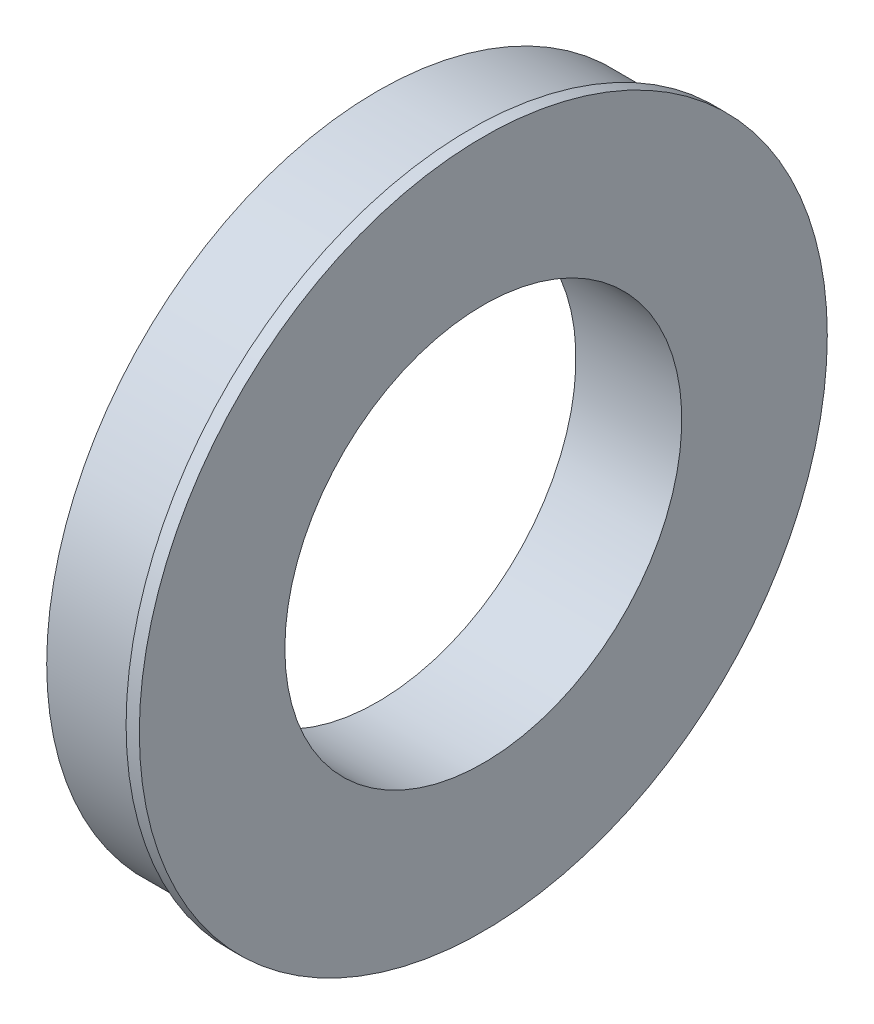
ISO-10303-21;
HEADER;
FILE_DESCRIPTION(('STEP AP214'),'2;1');
FILE_NAME('part.step','',(''),(''),'','','');
FILE_SCHEMA(('AUTOMOTIVE_DESIGN { 1 0 10303 214 1 1 1 1 }'));
ENDSEC;
DATA;
#1=APPLICATION_CONTEXT('core data for automotive mechanical design processes');
#2=APPLICATION_PROTOCOL_DEFINITION('international standard','automotive_design',2000,#1);
#3=PRODUCT_CONTEXT('',#1,'mechanical');
#4=PRODUCT('Part','Part','',(#3));
#5=PRODUCT_RELATED_PRODUCT_CATEGORY('part','',(#4));
#6=PRODUCT_DEFINITION_FORMATION('','',#4);
#7=PRODUCT_DEFINITION_CONTEXT('part definition',#1,'design');
#8=PRODUCT_DEFINITION('design','',#6,#7);
#9=PRODUCT_DEFINITION_SHAPE('','',#8);
#10=(LENGTH_UNIT() NAMED_UNIT(*) SI_UNIT(.MILLI.,.METRE.));
#11=(NAMED_UNIT(*) PLANE_ANGLE_UNIT() SI_UNIT($,.RADIAN.));
#12=(NAMED_UNIT(*) SI_UNIT($,.STERADIAN.) SOLID_ANGLE_UNIT());
#13=UNCERTAINTY_MEASURE_WITH_UNIT(LENGTH_MEASURE(1.E-05),#10,'distance_accuracy_value','');
#14=(GEOMETRIC_REPRESENTATION_CONTEXT(3) GLOBAL_UNCERTAINTY_ASSIGNED_CONTEXT((#13)) GLOBAL_UNIT_ASSIGNED_CONTEXT((#10,
#11,#12)) REPRESENTATION_CONTEXT('',''));
#15=CARTESIAN_POINT('',(0.,0.,0.));
#16=DIRECTION('',(0.,0.,1.));
#17=DIRECTION('',(1.,0.,0.));
#18=AXIS2_PLACEMENT_3D('',#15,#16,#17);
#19=CARTESIAN_POINT('',(10.795,0.,0.));
#20=DIRECTION('',(-1.,0.,0.));
#21=DIRECTION('',(0.,0.,1.));
#22=AXIS2_PLACEMENT_3D('',#19,#20,#21);
#23=CYLINDRICAL_SURFACE('',#22,66.04);
#24=CARTESIAN_POINT('',(10.795,0.,0.));
#25=DIRECTION('',(1.,0.,0.));
#26=DIRECTION('',(0.,0.,-1.));
#27=AXIS2_PLACEMENT_3D('',#24,#25,#26);
#28=CIRCLE('',#27,66.04);
#29=CARTESIAN_POINT('',(10.795,0.,-66.04));
#30=VERTEX_POINT('',#29);
#31=EDGE_CURVE('E82',#30,#30,#28,.T.);
#32=ORIENTED_EDGE('',*,*,#31,.F.);
#33=EDGE_LOOP('',(#32));
#34=FACE_BOUND('',#33,.T.);
#35=CARTESIAN_POINT('',(8.255,0.,0.));
#36=DIRECTION('',(1.,0.,0.));
#37=DIRECTION('',(0.,0.,-1.));
#38=AXIS2_PLACEMENT_3D('',#35,#36,#37);
#39=CIRCLE('',#38,66.04);
#40=CARTESIAN_POINT('',(8.255,0.,-66.04));
#41=VERTEX_POINT('',#40);
#42=EDGE_CURVE('E79',#41,#41,#39,.T.);
#43=ORIENTED_EDGE('',*,*,#42,.T.);
#44=EDGE_LOOP('',(#43));
#45=FACE_BOUND('',#44,.T.);
#46=ADVANCED_FACE('F65',(#34,#45),#23,.T.);
#47=CARTESIAN_POINT('',(8.255,0.,0.));
#48=DIRECTION('',(1.,0.,0.));
#49=DIRECTION('',(0.,0.,-1.));
#50=AXIS2_PLACEMENT_3D('',#47,#48,#49);
#51=PLANE('',#50);
#52=CARTESIAN_POINT('',(8.255,0.,0.));
#53=DIRECTION('',(1.,0.,0.));
#54=DIRECTION('',(0.,0.,-1.));
#55=AXIS2_PLACEMENT_3D('',#52,#53,#54);
#56=CIRCLE('',#55,63.5);
#57=CARTESIAN_POINT('',(8.255,0.,63.5));
#58=VERTEX_POINT('',#57);
#59=EDGE_CURVE('E11',#58,#58,#56,.T.);
#60=ORIENTED_EDGE('',*,*,#59,.T.);
#61=EDGE_LOOP('',(#60));
#62=FACE_BOUND('',#61,.T.);
#63=ORIENTED_EDGE('',*,*,#42,.F.);
#64=EDGE_LOOP('',(#63));
#65=FACE_BOUND('',#64,.T.);
#66=ADVANCED_FACE('F110',(#62,#65),#51,.F.);
#67=CARTESIAN_POINT('',(10.795,0.,0.));
#68=DIRECTION('',(1.,0.,0.));
#69=DIRECTION('',(0.,0.,-1.));
#70=AXIS2_PLACEMENT_3D('',#67,#68,#69);
#71=PLANE('',#70);
#72=CARTESIAN_POINT('',(10.795,0.,0.));
#73=DIRECTION('',(-1.,0.,0.));
#74=DIRECTION('',(0.,0.,1.));
#75=AXIS2_PLACEMENT_3D('',#72,#73,#74);
#76=CIRCLE('',#75,38.1);
#77=CARTESIAN_POINT('',(10.795,0.,38.1));
#78=VERTEX_POINT('',#77);
#79=EDGE_CURVE('E89',#78,#78,#76,.T.);
#80=ORIENTED_EDGE('',*,*,#79,.T.);
#81=EDGE_LOOP('',(#80));
#82=FACE_BOUND('',#81,.T.);
#83=ORIENTED_EDGE('',*,*,#31,.T.);
#84=EDGE_LOOP('',(#83));
#85=FACE_BOUND('',#84,.T.);
#86=ADVANCED_FACE('F94',(#82,#85),#71,.T.);
#87=CARTESIAN_POINT('',(9.525,0.,0.));
#88=DIRECTION('',(-1.,0.,0.));
#89=DIRECTION('',(0.,0.,1.));
#90=AXIS2_PLACEMENT_3D('',#87,#88,#89);
#91=CYLINDRICAL_SURFACE('',#90,63.5);
#92=CARTESIAN_POINT('',(-9.525,0.,0.));
#93=DIRECTION('',(1.,0.,0.));
#94=DIRECTION('',(0.,0.,-1.));
#95=AXIS2_PLACEMENT_3D('',#92,#93,#94);
#96=CIRCLE('',#95,63.5);
#97=CARTESIAN_POINT('',(-9.525,0.,63.5));
#98=VERTEX_POINT('',#97);
#99=EDGE_CURVE('E69',#98,#98,#96,.T.);
#100=CARTESIAN_POINT('',(-9.525,0.,63.5));
#101=CARTESIAN_POINT('',(-9.33979166666667,0.,63.5));
#102=CARTESIAN_POINT('',(-9.15458333333333,0.,63.5));
#103=CARTESIAN_POINT('',(-8.78416666666667,0.,63.5));
#104=CARTESIAN_POINT('',(-8.59895833333333,0.,63.5));
#105=CARTESIAN_POINT('',(-8.22854166666666,0.,63.5));
#106=CARTESIAN_POINT('',(-8.04333333333333,0.,63.5));
#107=CARTESIAN_POINT('',(-7.67291666666667,0.,63.5));
#108=CARTESIAN_POINT('',(-7.48770833333333,0.,63.5));
#109=CARTESIAN_POINT('',(-7.11729166666667,0.,63.5));
#110=CARTESIAN_POINT('',(-6.93208333333333,0.,63.5));
#111=CARTESIAN_POINT('',(-6.56166666666667,0.,63.5));
#112=CARTESIAN_POINT('',(-6.37645833333333,0.,63.5));
#113=CARTESIAN_POINT('',(-6.00604166666667,0.,63.5));
#114=CARTESIAN_POINT('',(-5.82083333333333,0.,63.5));
#115=CARTESIAN_POINT('',(-5.45041666666667,0.,63.5));
#116=CARTESIAN_POINT('',(-5.26520833333333,0.,63.5));
#117=CARTESIAN_POINT('',(-4.89479166666667,0.,63.5));
#118=CARTESIAN_POINT('',(-4.70958333333333,0.,63.5));
#119=CARTESIAN_POINT('',(-4.33916666666667,0.,63.5));
#120=CARTESIAN_POINT('',(-4.15395833333333,0.,63.5));
#121=CARTESIAN_POINT('',(-3.78354166666667,0.,63.5));
#122=CARTESIAN_POINT('',(-3.59833333333333,0.,63.5));
#123=CARTESIAN_POINT('',(-3.22791666666667,0.,63.5));
#124=CARTESIAN_POINT('',(-3.04270833333333,0.,63.5));
#125=CARTESIAN_POINT('',(-2.67229166666667,0.,63.5));
#126=CARTESIAN_POINT('',(-2.48708333333333,0.,63.5));
#127=CARTESIAN_POINT('',(-2.11666666666667,0.,63.5));
#128=CARTESIAN_POINT('',(-1.93145833333333,0.,63.5));
#129=CARTESIAN_POINT('',(-1.56104166666667,0.,63.5));
#130=CARTESIAN_POINT('',(-1.37583333333333,0.,63.5));
#131=CARTESIAN_POINT('',(-1.00541666666667,0.,63.5));
#132=CARTESIAN_POINT('',(-0.820208333333334,0.,63.5));
#133=CARTESIAN_POINT('',(-0.449791666666667,0.,63.5));
#134=CARTESIAN_POINT('',(-0.264583333333333,0.,63.5));
#135=CARTESIAN_POINT('',(0.105833333333334,0.,63.5));
#136=CARTESIAN_POINT('',(0.291041666666667,0.,63.5));
#137=CARTESIAN_POINT('',(0.661458333333334,0.,63.5));
#138=CARTESIAN_POINT('',(0.846666666666667,0.,63.5));
#139=CARTESIAN_POINT('',(1.21708333333333,0.,63.5));
#140=CARTESIAN_POINT('',(1.40229166666667,0.,63.5));
#141=CARTESIAN_POINT('',(1.77270833333333,0.,63.5));
#142=CARTESIAN_POINT('',(1.95791666666667,0.,63.5));
#143=CARTESIAN_POINT('',(2.32833333333333,0.,63.5));
#144=CARTESIAN_POINT('',(2.51354166666667,0.,63.5));
#145=CARTESIAN_POINT('',(2.88395833333333,0.,63.5));
#146=CARTESIAN_POINT('',(3.06916666666667,0.,63.5));
#147=CARTESIAN_POINT('',(3.43958333333333,0.,63.5));
#148=CARTESIAN_POINT('',(3.62479166666667,0.,63.5));
#149=CARTESIAN_POINT('',(3.99520833333333,0.,63.5));
#150=CARTESIAN_POINT('',(4.18041666666667,0.,63.5));
#151=CARTESIAN_POINT('',(4.55083333333333,0.,63.5));
#152=CARTESIAN_POINT('',(4.73604166666667,0.,63.5));
#153=CARTESIAN_POINT('',(5.10645833333333,0.,63.5));
#154=CARTESIAN_POINT('',(5.29166666666667,0.,63.5));
#155=CARTESIAN_POINT('',(5.66208333333333,0.,63.5));
#156=CARTESIAN_POINT('',(5.84729166666667,0.,63.5));
#157=CARTESIAN_POINT('',(6.21770833333333,0.,63.5));
#158=CARTESIAN_POINT('',(6.40291666666667,0.,63.5));
#159=CARTESIAN_POINT('',(6.77333333333333,0.,63.5));
#160=CARTESIAN_POINT('',(6.95854166666667,0.,63.5));
#161=CARTESIAN_POINT('',(7.32895833333333,0.,63.5));
#162=CARTESIAN_POINT('',(7.51416666666667,0.,63.5));
#163=CARTESIAN_POINT('',(7.88458333333333,0.,63.5));
#164=CARTESIAN_POINT('',(8.06979166666667,0.,63.5));
#165=CARTESIAN_POINT('',(8.255,0.,63.5));
#166=B_SPLINE_CURVE_WITH_KNOTS('',3,(#100,#101,#102,#103,#104,#105,#106,#107,#108,#109,#110,
#111,#112,#113,#114,#115,#116,#117,#118,#119,#120,#121,#122,#123,#124,#125,#126,#127,#128,#129,
#130,#131,#132,#133,#134,#135,#136,#137,#138,#139,#140,#141,#142,#143,#144,#145,#146,#147,#148,
#149,#150,#151,#152,#153,#154,#155,#156,#157,#158,#159,#160,#161,#162,#163,#164,#165),
.UNSPECIFIED.,.F.,.F.,(4,2,2,2,2,2,2,2,2,2,2,2,2,2,2,2,2,2,2,2,2,2,2,2,2,2,2,2,2,2,2,2,4),(0.,
0.555625000000001,1.11125,1.666875,2.2225,2.778125,3.33375,3.889375,4.445,5.000625,5.55625,
6.111875,6.6675,7.223125,7.77875,8.334375,8.89,9.445625,10.00125,10.556875,11.1125,11.668125,
12.22375,12.779375,13.335,13.890625,14.44625,15.001875,15.5575,16.113125,16.66875,17.224375,
17.78),.UNSPECIFIED.);
#167=EDGE_CURVE('BSEAM67',#98,#58,#166,.T.);
#168=ORIENTED_EDGE('',*,*,#99,.T.);
#169=ORIENTED_EDGE('',*,*,#59,.F.);
#170=ORIENTED_EDGE('',*,*,#167,.T.);
#171=ORIENTED_EDGE('',*,*,#167,.F.);
#172=EDGE_LOOP('',(#168,#170,#169,#171));
#173=FACE_BOUND('',#172,.T.);
#174=ADVANCED_FACE('F67',(#173),#91,.T.);
#175=CARTESIAN_POINT('',(9.525,0.,0.));
#176=DIRECTION('',(-1.,0.,0.));
#177=DIRECTION('',(0.,0.,1.));
#178=AXIS2_PLACEMENT_3D('',#175,#176,#177);
#179=CYLINDRICAL_SURFACE('',#178,38.1);
#180=CARTESIAN_POINT('',(-9.525,0.,0.));
#181=DIRECTION('',(1.,0.,0.));
#182=DIRECTION('',(0.,0.,-1.));
#183=AXIS2_PLACEMENT_3D('',#180,#181,#182);
#184=CIRCLE('',#183,38.1);
#185=CARTESIAN_POINT('',(-9.525,0.,38.1));
#186=VERTEX_POINT('',#185);
#187=EDGE_CURVE('E77',#186,#186,#184,.T.);
#188=CARTESIAN_POINT('',(-9.525,0.,38.1));
#189=CARTESIAN_POINT('',(-9.31333333333333,0.,38.1));
#190=CARTESIAN_POINT('',(-9.10166666666667,0.,38.1));
#191=CARTESIAN_POINT('',(-8.67833333333333,0.,38.1));
#192=CARTESIAN_POINT('',(-8.46666666666667,0.,38.1));
#193=CARTESIAN_POINT('',(-8.04333333333333,0.,38.1));
#194=CARTESIAN_POINT('',(-7.83166666666667,0.,38.1));
#195=CARTESIAN_POINT('',(-7.40833333333333,0.,38.1));
#196=CARTESIAN_POINT('',(-7.19666666666667,0.,38.1));
#197=CARTESIAN_POINT('',(-6.77333333333333,0.,38.1));
#198=CARTESIAN_POINT('',(-6.56166666666667,0.,38.1));
#199=CARTESIAN_POINT('',(-6.13833333333333,0.,38.1));
#200=CARTESIAN_POINT('',(-5.92666666666667,0.,38.1));
#201=CARTESIAN_POINT('',(-5.50333333333333,0.,38.1));
#202=CARTESIAN_POINT('',(-5.29166666666667,0.,38.1));
#203=CARTESIAN_POINT('',(-4.86833333333333,0.,38.1));
#204=CARTESIAN_POINT('',(-4.65666666666667,0.,38.1));
#205=CARTESIAN_POINT('',(-4.23333333333333,0.,38.1));
#206=CARTESIAN_POINT('',(-4.02166666666667,0.,38.1));
#207=CARTESIAN_POINT('',(-3.59833333333333,0.,38.1));
#208=CARTESIAN_POINT('',(-3.38666666666667,0.,38.1));
#209=CARTESIAN_POINT('',(-2.96333333333333,0.,38.1));
#210=CARTESIAN_POINT('',(-2.75166666666667,0.,38.1));
#211=CARTESIAN_POINT('',(-2.32833333333333,0.,38.1));
#212=CARTESIAN_POINT('',(-2.11666666666667,0.,38.1));
#213=CARTESIAN_POINT('',(-1.69333333333333,0.,38.1));
#214=CARTESIAN_POINT('',(-1.48166666666667,0.,38.1));
#215=CARTESIAN_POINT('',(-1.05833333333333,0.,38.1));
#216=CARTESIAN_POINT('',(-0.846666666666667,0.,38.1));
#217=CARTESIAN_POINT('',(-0.423333333333333,0.,38.1));
#218=CARTESIAN_POINT('',(-0.211666666666667,0.,38.1));
#219=CARTESIAN_POINT('',(0.211666666666667,0.,38.1));
#220=CARTESIAN_POINT('',(0.423333333333333,0.,38.1));
#221=CARTESIAN_POINT('',(0.846666666666667,0.,38.1));
#222=CARTESIAN_POINT('',(1.05833333333333,0.,38.1));
#223=CARTESIAN_POINT('',(1.48166666666667,0.,38.1));
#224=CARTESIAN_POINT('',(1.69333333333333,0.,38.1));
#225=CARTESIAN_POINT('',(2.11666666666667,0.,38.1));
#226=CARTESIAN_POINT('',(2.32833333333333,0.,38.1));
#227=CARTESIAN_POINT('',(2.75166666666667,0.,38.1));
#228=CARTESIAN_POINT('',(2.96333333333333,0.,38.1));
#229=CARTESIAN_POINT('',(3.38666666666667,0.,38.1));
#230=CARTESIAN_POINT('',(3.59833333333333,0.,38.1));
#231=CARTESIAN_POINT('',(4.02166666666667,0.,38.1));
#232=CARTESIAN_POINT('',(4.23333333333333,0.,38.1));
#233=CARTESIAN_POINT('',(4.65666666666667,0.,38.1));
#234=CARTESIAN_POINT('',(4.86833333333333,0.,38.1));
#235=CARTESIAN_POINT('',(5.29166666666667,0.,38.1));
#236=CARTESIAN_POINT('',(5.50333333333333,0.,38.1));
#237=CARTESIAN_POINT('',(5.92666666666667,0.,38.1));
#238=CARTESIAN_POINT('',(6.13833333333333,0.,38.1));
#239=CARTESIAN_POINT('',(6.56166666666667,0.,38.1));
#240=CARTESIAN_POINT('',(6.77333333333333,0.,38.1));
#241=CARTESIAN_POINT('',(7.19666666666667,0.,38.1));
#242=CARTESIAN_POINT('',(7.40833333333333,0.,38.1));
#243=CARTESIAN_POINT('',(7.83166666666667,0.,38.1));
#244=CARTESIAN_POINT('',(8.04333333333333,0.,38.1));
#245=CARTESIAN_POINT('',(8.46666666666667,0.,38.1));
#246=CARTESIAN_POINT('',(8.67833333333333,0.,38.1));
#247=CARTESIAN_POINT('',(9.10166666666667,0.,38.1));
#248=CARTESIAN_POINT('',(9.31333333333333,0.,38.1));
#249=CARTESIAN_POINT('',(9.73666666666667,0.,38.1));
#250=CARTESIAN_POINT('',(9.94833333333333,0.,38.1));
#251=CARTESIAN_POINT('',(10.3716666666667,0.,38.1));
#252=CARTESIAN_POINT('',(10.5833333333333,0.,38.1));
#253=CARTESIAN_POINT('',(10.795,0.,38.1));
#254=B_SPLINE_CURVE_WITH_KNOTS('',3,(#188,#189,#190,#191,#192,#193,#194,#195,#196,#197,#198,
#199,#200,#201,#202,#203,#204,#205,#206,#207,#208,#209,#210,#211,#212,#213,#214,#215,#216,#217,
#218,#219,#220,#221,#222,#223,#224,#225,#226,#227,#228,#229,#230,#231,#232,#233,#234,#235,#236,
#237,#238,#239,#240,#241,#242,#243,#244,#245,#246,#247,#248,#249,#250,#251,#252,#253),
.UNSPECIFIED.,.F.,.F.,(4,2,2,2,2,2,2,2,2,2,2,2,2,2,2,2,2,2,2,2,2,2,2,2,2,2,2,2,2,2,2,2,4),(0.,
0.635,1.27,1.905,2.54,3.175,3.81,4.445,5.08,5.715,6.35,6.985,7.62,8.255,8.89,9.525,10.16,10.795,
11.43,12.065,12.7,13.335,13.97,14.605,15.24,15.875,16.51,17.145,17.78,18.415,19.05,19.685,
20.32),.UNSPECIFIED.);
#255=EDGE_CURVE('BSEAM96',#186,#78,#254,.T.);
#256=ORIENTED_EDGE('',*,*,#187,.F.);
#257=ORIENTED_EDGE('',*,*,#79,.F.);
#258=ORIENTED_EDGE('',*,*,#255,.T.);
#259=ORIENTED_EDGE('',*,*,#255,.F.);
#260=EDGE_LOOP('',(#256,#258,#257,#259));
#261=FACE_BOUND('',#260,.T.);
#262=ADVANCED_FACE('F96',(#261),#179,.F.);
#263=CARTESIAN_POINT('',(-9.525,0.,0.));
#264=DIRECTION('',(1.,0.,0.));
#265=DIRECTION('',(0.,0.,-1.));
#266=AXIS2_PLACEMENT_3D('',#263,#264,#265);
#267=PLANE('',#266);
#268=ORIENTED_EDGE('',*,*,#99,.F.);
#269=EDGE_LOOP('',(#268));
#270=FACE_BOUND('',#269,.T.);
#271=ORIENTED_EDGE('',*,*,#187,.T.);
#272=EDGE_LOOP('',(#271));
#273=FACE_BOUND('',#272,.T.);
#274=ADVANCED_FACE('F98',(#270,#273),#267,.F.);
#275=CLOSED_SHELL('',(#46,#66,#86,#174,#262,#274));
#276=MANIFOLD_SOLID_BREP('B2',#275);
#277=ADVANCED_BREP_SHAPE_REPRESENTATION('',(#18,#276),#14);
#278=SHAPE_DEFINITION_REPRESENTATION(#9,#277);
ENDSEC;
END-ISO-10303-21;
